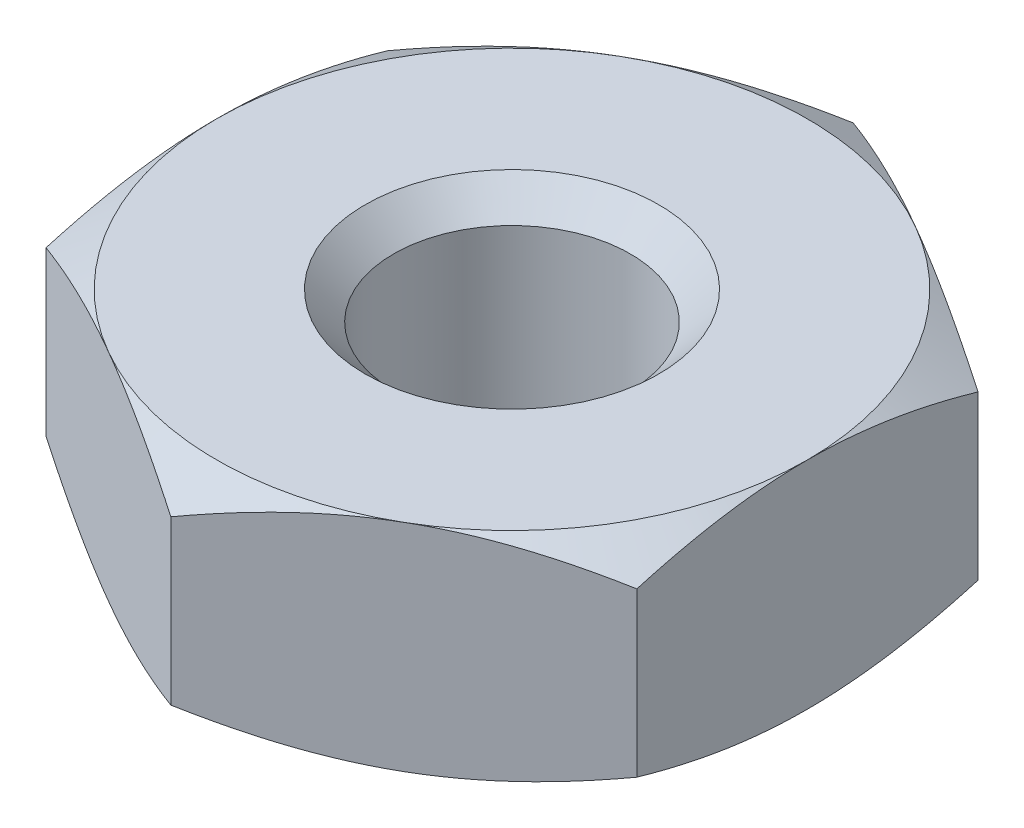
ISO-10303-21;
HEADER;
FILE_DESCRIPTION(('STEP AP214'),'2;1');
FILE_NAME('part.step','',(''),(''),'','','');
FILE_SCHEMA(('AUTOMOTIVE_DESIGN { 1 0 10303 214 1 1 1 1 }'));
ENDSEC;
DATA;
#1=APPLICATION_CONTEXT('core data for automotive mechanical design processes');
#2=APPLICATION_PROTOCOL_DEFINITION('international standard','automotive_design',2000,#1);
#3=PRODUCT_CONTEXT('',#1,'mechanical');
#4=PRODUCT('Part','Part','',(#3));
#5=PRODUCT_RELATED_PRODUCT_CATEGORY('part','',(#4));
#6=PRODUCT_DEFINITION_FORMATION('','',#4);
#7=PRODUCT_DEFINITION_CONTEXT('part definition',#1,'design');
#8=PRODUCT_DEFINITION('design','',#6,#7);
#9=PRODUCT_DEFINITION_SHAPE('','',#8);
#10=(LENGTH_UNIT() NAMED_UNIT(*) SI_UNIT(.MILLI.,.METRE.));
#11=(NAMED_UNIT(*) PLANE_ANGLE_UNIT() SI_UNIT($,.RADIAN.));
#12=(NAMED_UNIT(*) SI_UNIT($,.STERADIAN.) SOLID_ANGLE_UNIT());
#13=UNCERTAINTY_MEASURE_WITH_UNIT(LENGTH_MEASURE(1.E-05),#10,'distance_accuracy_value','');
#14=(GEOMETRIC_REPRESENTATION_CONTEXT(3) GLOBAL_UNCERTAINTY_ASSIGNED_CONTEXT((#13)) GLOBAL_UNIT_ASSIGNED_CONTEXT((#10,
#11,#12)) REPRESENTATION_CONTEXT('',''));
#15=CARTESIAN_POINT('',(0.,0.,0.));
#16=DIRECTION('',(0.,0.,1.));
#17=DIRECTION('',(1.,0.,0.));
#18=AXIS2_PLACEMENT_3D('',#15,#16,#17);
#19=CARTESIAN_POINT('',(0.,1.4478,0.));
#20=DIRECTION('',(0.,1.,0.));
#21=DIRECTION('',(0.,0.,1.));
#22=AXIS2_PLACEMENT_3D('',#19,#20,#21);
#23=PLANE('',#22);
#24=CARTESIAN_POINT('',(0.,1.4478,0.));
#25=DIRECTION('',(0.,1.,0.));
#26=DIRECTION('',(0.,0.,1.));
#27=AXIS2_PLACEMENT_3D('',#24,#25,#26);
#28=CIRCLE('',#27,1.96850000000001);
#29=CARTESIAN_POINT('',(0.,1.4478,1.96850000000001));
#30=VERTEX_POINT('',#29);
#31=EDGE_CURVE('E44',#30,#30,#28,.F.);
#32=ORIENTED_EDGE('',*,*,#31,.T.);
#33=EDGE_LOOP('',(#32));
#34=FACE_BOUND('',#33,.T.);
#35=CARTESIAN_POINT('',(0.,1.4478,0.));
#36=DIRECTION('',(0.,1.,0.));
#37=DIRECTION('',(0.,0.,1.));
#38=AXIS2_PLACEMENT_3D('',#35,#36,#37);
#39=CIRCLE('',#38,3.9624);
#40=CARTESIAN_POINT('',(-1.9812,1.4478,3.43153905995546));
#41=VERTEX_POINT('',#40);
#42=CARTESIAN_POINT('',(-3.9624,1.4478,0.));
#43=VERTEX_POINT('',#42);
#44=EDGE_CURVE('E183',#41,#43,#39,.F.);
#45=ORIENTED_EDGE('',*,*,#44,.F.);
#46=CARTESIAN_POINT('',(1.9812,1.4478,3.43153905995546));
#47=VERTEX_POINT('',#46);
#48=EDGE_CURVE('E132',#47,#41,#39,.F.);
#49=ORIENTED_EDGE('',*,*,#48,.F.);
#50=CARTESIAN_POINT('',(0.,1.4478,0.));
#51=DIRECTION('',(0.,1.,0.));
#52=DIRECTION('',(0.,0.,1.));
#53=AXIS2_PLACEMENT_3D('',#50,#51,#52);
#54=CIRCLE('',#53,3.9624);
#55=CARTESIAN_POINT('',(3.9624,1.4478,0.));
#56=VERTEX_POINT('',#55);
#57=EDGE_CURVE('E329',#47,#56,#54,.T.);
#58=ORIENTED_EDGE('',*,*,#57,.T.);
#59=CARTESIAN_POINT('',(1.9812,1.4478,-3.43153905995546));
#60=VERTEX_POINT('',#59);
#61=EDGE_CURVE('E182',#60,#56,#39,.F.);
#62=ORIENTED_EDGE('',*,*,#61,.F.);
#63=CARTESIAN_POINT('',(-1.9812,1.4478,-3.43153905995546));
#64=VERTEX_POINT('',#63);
#65=EDGE_CURVE('E342',#64,#60,#39,.F.);
#66=ORIENTED_EDGE('',*,*,#65,.F.);
#67=EDGE_CURVE('E343',#43,#64,#39,.F.);
#68=ORIENTED_EDGE('',*,*,#67,.F.);
#69=EDGE_LOOP('',(#45,#49,#58,#62,#66,#68));
#70=FACE_BOUND('',#69,.T.);
#71=ADVANCED_FACE('F35',(#34,#70),#23,.T.);
#72=CARTESIAN_POINT('',(0.,-1.4478,0.));
#73=DIRECTION('',(0.,1.,0.));
#74=DIRECTION('',(0.,0.,1.));
#75=AXIS2_PLACEMENT_3D('',#72,#73,#74);
#76=PLANE('',#75);
#77=CARTESIAN_POINT('',(0.,-1.4478,0.));
#78=DIRECTION('',(0.,1.,0.));
#79=DIRECTION('',(0.,0.,1.));
#80=AXIS2_PLACEMENT_3D('',#77,#78,#79);
#81=CIRCLE('',#80,1.9685);
#82=CARTESIAN_POINT('',(0.,-1.4478,1.9685));
#83=VERTEX_POINT('',#82);
#84=EDGE_CURVE('E11',#83,#83,#81,.T.);
#85=ORIENTED_EDGE('',*,*,#84,.T.);
#86=EDGE_LOOP('',(#85));
#87=FACE_BOUND('',#86,.T.);
#88=CARTESIAN_POINT('',(0.,-1.4478,0.));
#89=DIRECTION('',(0.,1.,0.));
#90=DIRECTION('',(0.,0.,1.));
#91=AXIS2_PLACEMENT_3D('',#88,#89,#90);
#92=CIRCLE('',#91,3.9624);
#93=CARTESIAN_POINT('',(1.9812,-1.4478,3.43153905995546));
#94=VERTEX_POINT('',#93);
#95=CARTESIAN_POINT('',(-1.9812,-1.4478,3.43153905995546));
#96=VERTEX_POINT('',#95);
#97=EDGE_CURVE('E176',#94,#96,#92,.F.);
#98=ORIENTED_EDGE('',*,*,#97,.T.);
#99=CARTESIAN_POINT('',(-3.9624,-1.4478,0.));
#100=VERTEX_POINT('',#99);
#101=EDGE_CURVE('E180',#96,#100,#92,.F.);
#102=ORIENTED_EDGE('',*,*,#101,.T.);
#103=CARTESIAN_POINT('',(-1.9812,-1.4478,-3.43153905995546));
#104=VERTEX_POINT('',#103);
#105=EDGE_CURVE('E510',#100,#104,#92,.F.);
#106=ORIENTED_EDGE('',*,*,#105,.T.);
#107=CARTESIAN_POINT('',(1.9812,-1.4478,-3.43153905995546));
#108=VERTEX_POINT('',#107);
#109=EDGE_CURVE('E517',#104,#108,#92,.F.);
#110=ORIENTED_EDGE('',*,*,#109,.T.);
#111=CARTESIAN_POINT('',(3.9624,-1.4478,0.));
#112=VERTEX_POINT('',#111);
#113=EDGE_CURVE('E179',#108,#112,#92,.F.);
#114=ORIENTED_EDGE('',*,*,#113,.T.);
#115=CARTESIAN_POINT('',(0.,-1.4478,0.));
#116=DIRECTION('',(0.,1.,0.));
#117=DIRECTION('',(0.,0.,1.));
#118=AXIS2_PLACEMENT_3D('',#115,#116,#117);
#119=CIRCLE('',#118,3.9624);
#120=EDGE_CURVE('E222',#94,#112,#119,.T.);
#121=ORIENTED_EDGE('',*,*,#120,.F.);
#122=EDGE_LOOP('',(#98,#102,#106,#110,#114,#121));
#123=FACE_BOUND('',#122,.T.);
#124=ADVANCED_FACE('F211',(#87,#123),#76,.F.);
#125=CARTESIAN_POINT('',(0.,1.4478,4.57538541327395));
#126=DIRECTION('',(-0.5,0.,-0.866025403784439));
#127=DIRECTION('',(-0.866025403784439,0.,0.5));
#128=AXIS2_PLACEMENT_3D('',#125,#126,#127);
#129=PLANE('',#128);
#130=DIRECTION('',(0.,-1.,0.));
#131=VECTOR('',#130,1.);
#132=CARTESIAN_POINT('',(3.9624,1.4478,2.28769270663697));
#133=LINE('',#132,#131);
#134=CARTESIAN_POINT('',(3.9624,1.09389270663698,2.28769270663697));
#135=VERTEX_POINT('',#134);
#136=CARTESIAN_POINT('',(3.9624,-1.09389270663698,2.28769270663697));
#137=VERTEX_POINT('',#136);
#138=EDGE_CURVE('E174',#135,#137,#133,.T.);
#139=ORIENTED_EDGE('',*,*,#138,.F.);
#140=CARTESIAN_POINT('',(3.9626,1.09382603744665,2.28757723658314));
#141=CARTESIAN_POINT('',(3.78847314196163,1.1518894991212,2.38810942494473));
#142=CARTESIAN_POINT('',(3.61284323080695,1.20469601498795,2.48950940142764));
#143=CARTESIAN_POINT('',(3.25854221893717,1.29687012185692,2.69406518600481));
#144=CARTESIAN_POINT('',(3.07986482298996,1.33620510539269,2.79722462865303));
#145=CARTESIAN_POINT('',(2.7247243918441,1.39743546926796,3.00226505217521));
#146=CARTESIAN_POINT('',(2.54831599798983,1.41973837460414,3.10411448585428));
#147=CARTESIAN_POINT('',(2.19466918684792,1.44636294973537,3.30829256746512));
#148=CARTESIAN_POINT('',(2.01743205489282,1.45070666746161,3.41062047330979));
#149=CARTESIAN_POINT('',(1.68625712619974,1.44166818984585,3.6018244075396));
#150=CARTESIAN_POINT('',(1.53226974326828,1.43050524671096,3.69072906452688));
#151=CARTESIAN_POINT('',(1.2252981998238,1.39512590299917,3.86795916776811));
#152=CARTESIAN_POINT('',(1.07231510099383,1.37089741783093,3.95628400105906));
#153=CARTESIAN_POINT('',(0.764710686885742,1.31032832849033,4.13387949234828));
#154=CARTESIAN_POINT('',(0.610128302070048,1.27373098455845,4.22312767383359));
#155=CARTESIAN_POINT('',(0.303269038029469,1.19066950108706,4.40029295253075));
#156=CARTESIAN_POINT('',(0.150988227754979,1.1442248770141,4.48821231933514));
#157=CARTESIAN_POINT('',(-0.000200000000001467,1.09382603744665,4.57550088332778));
#158=B_SPLINE_CURVE_WITH_KNOTS('',3,(#140,#141,#142,#143,#144,#145,#146,#147,#148,#149,#150,
#151,#152,#153,#154,#155,#156,#157),.UNSPECIFIED.,.F.,.F.,(4,2,2,2,2,2,2,2,4),(0.,
0.628087934683976,1.25768556849603,1.87170106915143,2.48496253800264,3.01893254763583,
3.55339728643647,4.09971704494744,4.64496405448818),.UNSPECIFIED.);
#159=EDGE_CURVE('E147',#135,#47,#158,.T.);
#160=ORIENTED_EDGE('',*,*,#159,.T.);
#161=CARTESIAN_POINT('',(0.,1.09389270663698,4.57538541327395));
#162=VERTEX_POINT('',#161);
#163=EDGE_CURVE('E130',#47,#162,#158,.T.);
#164=ORIENTED_EDGE('',*,*,#163,.T.);
#165=DIRECTION('',(0.,-1.,0.));
#166=VECTOR('',#165,1.);
#167=CARTESIAN_POINT('',(0.,1.4478,4.57538541327395));
#168=LINE('',#167,#166);
#169=CARTESIAN_POINT('',(0.,-1.09389270663698,4.57538541327395));
#170=VERTEX_POINT('',#169);
#171=EDGE_CURVE('E145',#162,#170,#168,.T.);
#172=ORIENTED_EDGE('',*,*,#171,.T.);
#173=CARTESIAN_POINT('',(-0.000200000000001955,-1.09382603744665,4.57550088332778));
#174=CARTESIAN_POINT('',(0.173926858038368,-1.1518894991212,4.47496869496619));
#175=CARTESIAN_POINT('',(0.349556769193047,-1.20469601498795,4.37356871848328));
#176=CARTESIAN_POINT('',(0.703857781062827,-1.29687012185692,4.16901293390611));
#177=CARTESIAN_POINT('',(0.882535177010035,-1.33620510539269,4.06585349125789));
#178=CARTESIAN_POINT('',(1.23767560815589,-1.39743546926796,3.86081306773571));
#179=CARTESIAN_POINT('',(1.41408400201016,-1.41973837460414,3.75896363405664));
#180=CARTESIAN_POINT('',(1.76773081315207,-1.44636294973537,3.5547855524458));
#181=CARTESIAN_POINT('',(1.94496794510717,-1.45070666746161,3.45245764660113));
#182=CARTESIAN_POINT('',(2.27614287380026,-1.44166818984585,3.26125371237132));
#183=CARTESIAN_POINT('',(2.43013025673171,-1.43050524671096,3.17234905538404));
#184=CARTESIAN_POINT('',(2.73710180017619,-1.39512590299917,2.99511895214281));
#185=CARTESIAN_POINT('',(2.89008489900617,-1.37089741783093,2.90679411885186));
#186=CARTESIAN_POINT('',(3.19768931311425,-1.31032832849033,2.72919862756264));
#187=CARTESIAN_POINT('',(3.35227169792995,-1.27373098455845,2.63995044607733));
#188=CARTESIAN_POINT('',(3.65913096197053,-1.19066950108706,2.46278516738017));
#189=CARTESIAN_POINT('',(3.81141177224502,-1.1442248770141,2.37486580057578));
#190=CARTESIAN_POINT('',(3.9626,-1.09382603744665,2.28757723658314));
#191=B_SPLINE_CURVE_WITH_KNOTS('',3,(#173,#174,#175,#176,#177,#178,#179,#180,#181,#182,#183,
#184,#185,#186,#187,#188,#189,#190),.UNSPECIFIED.,.F.,.F.,(4,2,2,2,2,2,2,2,4),(0.,
0.628087934683977,1.25768556849603,1.87170106915143,2.48496253800264,3.01893254763583,
3.55339728643647,4.09971704494744,4.64496405448818),.UNSPECIFIED.);
#192=EDGE_CURVE('E155',#170,#94,#191,.T.);
#193=ORIENTED_EDGE('',*,*,#192,.T.);
#194=EDGE_CURVE('E159',#94,#137,#191,.T.);
#195=ORIENTED_EDGE('',*,*,#194,.T.);
#196=EDGE_LOOP('',(#139,#160,#164,#172,#193,#195));
#197=FACE_BOUND('',#196,.T.);
#198=ADVANCED_FACE('F143',(#197),#129,.F.);
#199=CARTESIAN_POINT('',(3.9624,1.4478,2.28769270663697));
#200=DIRECTION('',(-1.,0.,0.));
#201=DIRECTION('',(0.,0.,1.));
#202=AXIS2_PLACEMENT_3D('',#199,#200,#201);
#203=PLANE('',#202);
#204=DIRECTION('',(0.,-1.,0.));
#205=VECTOR('',#204,1.);
#206=CARTESIAN_POINT('',(3.9624,1.4478,-2.28769270663697));
#207=LINE('',#206,#205);
#208=CARTESIAN_POINT('',(3.9624,1.09389270663698,-2.28769270663697));
#209=VERTEX_POINT('',#208);
#210=CARTESIAN_POINT('',(3.9624,-1.09389270663698,-2.28769270663697));
#211=VERTEX_POINT('',#210);
#212=EDGE_CURVE('E172',#209,#211,#207,.T.);
#213=ORIENTED_EDGE('',*,*,#212,.F.);
#214=CARTESIAN_POINT('',(3.9624,-0.846827955176388,-6.87694511996759));
#215=CARTESIAN_POINT('',(3.9624,-0.764498186575615,-6.7123428075543));
#216=CARTESIAN_POINT('',(3.9624,-0.682736776901853,-6.54745319961846));
#217=CARTESIAN_POINT('',(3.9624,-0.520625337655295,-6.21696845103487));
#218=CARTESIAN_POINT('',(3.9624,-0.440275402756545,-6.05137326397937));
#219=CARTESIAN_POINT('',(3.9624,-0.281112361448725,-5.7190336854968));
#220=CARTESIAN_POINT('',(3.9624,-0.202302680236489,-5.55228765019459));
#221=CARTESIAN_POINT('',(3.9624,-0.0467689561747381,-5.21782783253457));
#222=CARTESIAN_POINT('',(3.9624,0.0299551275225364,-5.05011406920843));
#223=CARTESIAN_POINT('',(3.9624,0.184230945588609,-4.70595985799169));
#224=CARTESIAN_POINT('',(3.9624,0.261664588531371,-4.52946629764683));
#225=CARTESIAN_POINT('',(3.9624,0.413004481416677,-4.17497466521404));
#226=CARTESIAN_POINT('',(3.9624,0.486910854345802,-3.99697664583772));
#227=CARTESIAN_POINT('',(3.9624,0.630207267728787,-3.63928118207367));
#228=CARTESIAN_POINT('',(3.9624,0.699599911918298,-3.45958478715711));
#229=CARTESIAN_POINT('',(3.9624,0.832654360967113,-3.09809221292883));
#230=CARTESIAN_POINT('',(3.9624,0.896316793732896,-2.91629626615157));
#231=CARTESIAN_POINT('',(3.9624,1.03038741805603,-2.50735389421121));
#232=CARTESIAN_POINT('',(3.9624,1.0988772262701,-2.27956883786375));
#233=CARTESIAN_POINT('',(3.9624,1.22079661971305,-1.81989180667724));
#234=CARTESIAN_POINT('',(3.9624,1.27422755821815,-1.58800020286789));
#235=CARTESIAN_POINT('',(3.9624,1.33932352898976,-1.23939483965845));
#236=CARTESIAN_POINT('',(3.9624,1.35841275888706,-1.1240547546709));
#237=CARTESIAN_POINT('',(3.9624,1.3913617031769,-0.89263647119892));
#238=CARTESIAN_POINT('',(3.9624,1.40522217228751,-0.77655838169925));
#239=CARTESIAN_POINT('',(3.9624,1.42729886995324,-0.543896135981941));
#240=CARTESIAN_POINT('',(3.9624,1.43551672447737,-0.427312135299846));
#241=CARTESIAN_POINT('',(3.9624,1.44604863251693,-0.193875693749986));
#242=CARTESIAN_POINT('',(3.9624,1.44836271085358,-0.0770232540128857));
#243=CARTESIAN_POINT('',(3.9624,1.44700228200561,0.157348029925358));
#244=CARTESIAN_POINT('',(3.9624,1.44329182782577,0.274866674145883));
#245=CARTESIAN_POINT('',(3.9624,1.42994860440544,0.509557759656442));
#246=CARTESIAN_POINT('',(3.9624,1.42031580885376,0.626730199406068));
#247=CARTESIAN_POINT('',(3.9624,1.38295531470112,0.977410309509105));
#248=CARTESIAN_POINT('',(3.9624,1.3467658598802,1.21004543714717));
#249=CARTESIAN_POINT('',(3.9624,1.25498527482723,1.67541715445484));
#250=CARTESIAN_POINT('',(3.9624,1.19907377102914,1.90808780532356));
#251=CARTESIAN_POINT('',(3.9624,1.07255670895525,2.36946057952585));
#252=CARTESIAN_POINT('',(3.9624,1.00194288838555,2.59816039272877));
#253=CARTESIAN_POINT('',(3.9624,0.866020327811573,3.00368556929757));
#254=CARTESIAN_POINT('',(3.9624,0.802769204408394,3.18121382947534));
#255=CARTESIAN_POINT('',(3.9624,0.671000342458403,3.53424143457496));
#256=CARTESIAN_POINT('',(3.9624,0.602484053417731,3.70974132271269));
#257=CARTESIAN_POINT('',(3.9624,0.461253205392453,4.05917312481852));
#258=CARTESIAN_POINT('',(3.9624,0.388535803591991,4.23310388274967));
#259=CARTESIAN_POINT('',(3.9624,0.239805004282646,4.57955182070199));
#260=CARTESIAN_POINT('',(3.9624,0.163791505153723,4.75206895694539));
#261=CARTESIAN_POINT('',(3.9624,0.0123957578320725,5.08865289065001));
#262=CARTESIAN_POINT('',(3.9624,-0.0628775500154029,5.25276884371343));
#263=CARTESIAN_POINT('',(3.9624,-0.215395379140379,5.58007748279647));
#264=CARTESIAN_POINT('',(3.9624,-0.292639869827929,5.7432701830957));
#265=CARTESIAN_POINT('',(3.9624,-0.448610872481416,6.06858881324152));
#266=CARTESIAN_POINT('',(3.9624,-0.52733451703435,6.23071612062808));
#267=CARTESIAN_POINT('',(3.9624,-0.686132811219577,6.55430258198902));
#268=CARTESIAN_POINT('',(3.9624,-0.766207423134149,6.71576175446089));
#269=CARTESIAN_POINT('',(3.9624,-0.846827955176393,6.87694511996759));
#270=B_SPLINE_CURVE_WITH_KNOTS('',3,(#214,#215,#216,#217,#218,#219,#220,#221,#222,#223,#224,
#225,#226,#227,#228,#229,#230,#231,#232,#233,#234,#235,#236,#237,#238,#239,#240,#241,#242,#243,
#244,#245,#246,#247,#248,#249,#250,#251,#252,#253,#254,#255,#256,#257,#258,#259,#260,#261,#262,
#263,#264,#265,#266,#267,#268,#269),.UNSPECIFIED.,.F.,.F.,(4,2,2,2,2,2,2,2,2,2,2,2,2,2,2,2,2,2,
2,2,2,2,2,2,2,2,2,4),(0.,0.55213425333843,1.10430540050877,1.6575898398137,2.21086343487001,
2.78903155916892,3.36717950952376,3.94499094331812,4.52273898427512,5.2359552082885,
5.9491073181582,6.29973465806838,6.65031136913128,7.00078701598875,7.35126118933977,
7.70383425668021,8.0564088904094,8.76166369177209,9.47894678955384,10.1966340738072,
10.7619206037852,11.3270520634525,11.8925705212031,12.4581064265345,12.9997560719459,
13.5413973168318,14.082079166822,14.6227459463884),.UNSPECIFIED.);
#271=EDGE_CURVE('E298',#209,#56,#270,.T.);
#272=ORIENTED_EDGE('',*,*,#271,.T.);
#273=EDGE_CURVE('E291',#56,#135,#270,.T.);
#274=ORIENTED_EDGE('',*,*,#273,.T.);
#275=ORIENTED_EDGE('',*,*,#138,.T.);
#276=CARTESIAN_POINT('',(3.9624,0.846827955176392,6.87694511996759));
#277=CARTESIAN_POINT('',(3.9624,0.764498186575619,6.7123428075543));
#278=CARTESIAN_POINT('',(3.9624,0.682736776901857,6.54745319961846));
#279=CARTESIAN_POINT('',(3.9624,0.520625337655299,6.21696845103487));
#280=CARTESIAN_POINT('',(3.9624,0.44027540275655,6.05137326397937));
#281=CARTESIAN_POINT('',(3.9624,0.28111236144873,5.7190336854968));
#282=CARTESIAN_POINT('',(3.9624,0.202302680236493,5.55228765019459));
#283=CARTESIAN_POINT('',(3.9624,0.0467689561747428,5.21782783253457));
#284=CARTESIAN_POINT('',(3.9624,-0.0299551275225319,5.05011406920843));
#285=CARTESIAN_POINT('',(3.9624,-0.184230945588605,4.7059598579917));
#286=CARTESIAN_POINT('',(3.9624,-0.261664588531367,4.52946629764684));
#287=CARTESIAN_POINT('',(3.9624,-0.413004481416672,4.17497466521405));
#288=CARTESIAN_POINT('',(3.9624,-0.486910854345797,3.99697664583773));
#289=CARTESIAN_POINT('',(3.9624,-0.630207267728783,3.63928118207367));
#290=CARTESIAN_POINT('',(3.9624,-0.699599911918295,3.45958478715712));
#291=CARTESIAN_POINT('',(3.9624,-0.83265436096711,3.09809221292883));
#292=CARTESIAN_POINT('',(3.9624,-0.896316793732893,2.91629626615157));
#293=CARTESIAN_POINT('',(3.9624,-1.03038741805602,2.50735389421121));
#294=CARTESIAN_POINT('',(3.9624,-1.0988772262701,2.27956883786376));
#295=CARTESIAN_POINT('',(3.9624,-1.22079661971305,1.81989180667724));
#296=CARTESIAN_POINT('',(3.9624,-1.27422755821815,1.58800020286789));
#297=CARTESIAN_POINT('',(3.9624,-1.33932352898976,1.23939483965845));
#298=CARTESIAN_POINT('',(3.9624,-1.35841275888706,1.1240547546709));
#299=CARTESIAN_POINT('',(3.9624,-1.3913617031769,0.892636471198924));
#300=CARTESIAN_POINT('',(3.9624,-1.40522217228751,0.776558381699254));
#301=CARTESIAN_POINT('',(3.9624,-1.42729886995324,0.543896135981944));
#302=CARTESIAN_POINT('',(3.9624,-1.43551672447737,0.427312135299849));
#303=CARTESIAN_POINT('',(3.9624,-1.44604863251693,0.19387569374999));
#304=CARTESIAN_POINT('',(3.9624,-1.44836271085358,0.0770232540128899));
#305=CARTESIAN_POINT('',(3.9624,-1.44700228200561,-0.157348029925353));
#306=CARTESIAN_POINT('',(3.9624,-1.44329182782577,-0.274866674145878));
#307=CARTESIAN_POINT('',(3.9624,-1.42994860440544,-0.509557759656438));
#308=CARTESIAN_POINT('',(3.9624,-1.42031580885376,-0.626730199406064));
#309=CARTESIAN_POINT('',(3.9624,-1.38295531470112,-0.977410309509102));
#310=CARTESIAN_POINT('',(3.9624,-1.3467658598802,-1.21004543714716));
#311=CARTESIAN_POINT('',(3.9624,-1.25498527482723,-1.67541715445483));
#312=CARTESIAN_POINT('',(3.9624,-1.19907377102915,-1.90808780532356));
#313=CARTESIAN_POINT('',(3.9624,-1.07255670895526,-2.36946057952584));
#314=CARTESIAN_POINT('',(3.9624,-1.00194288838556,-2.59816039272877));
#315=CARTESIAN_POINT('',(3.9624,-0.866020327811575,-3.00368556929757));
#316=CARTESIAN_POINT('',(3.9624,-0.802769204408396,-3.18121382947534));
#317=CARTESIAN_POINT('',(3.9624,-0.671000342458407,-3.53424143457495));
#318=CARTESIAN_POINT('',(3.9624,-0.602484053417734,-3.70974132271268));
#319=CARTESIAN_POINT('',(3.9624,-0.461253205392456,-4.05917312481852));
#320=CARTESIAN_POINT('',(3.9624,-0.388535803591994,-4.23310388274966));
#321=CARTESIAN_POINT('',(3.9624,-0.239805004282649,-4.57955182070199));
#322=CARTESIAN_POINT('',(3.9624,-0.163791505153726,-4.75206895694539));
#323=CARTESIAN_POINT('',(3.9624,-0.0123957578320757,-5.08865289065001));
#324=CARTESIAN_POINT('',(3.9624,0.0628775500153997,-5.25276884371343));
#325=CARTESIAN_POINT('',(3.9624,0.215395379140375,-5.58007748279646));
#326=CARTESIAN_POINT('',(3.9624,0.292639869827925,-5.7432701830957));
#327=CARTESIAN_POINT('',(3.9624,0.448610872481412,-6.06858881324152));
#328=CARTESIAN_POINT('',(3.9624,0.527334517034345,-6.23071612062808));
#329=CARTESIAN_POINT('',(3.9624,0.686132811219573,-6.55430258198902));
#330=CARTESIAN_POINT('',(3.9624,0.766207423134145,-6.71576175446088));
#331=CARTESIAN_POINT('',(3.9624,0.846827955176387,-6.87694511996759));
#332=B_SPLINE_CURVE_WITH_KNOTS('',3,(#276,#277,#278,#279,#280,#281,#282,#283,#284,#285,#286,
#287,#288,#289,#290,#291,#292,#293,#294,#295,#296,#297,#298,#299,#300,#301,#302,#303,#304,#305,
#306,#307,#308,#309,#310,#311,#312,#313,#314,#315,#316,#317,#318,#319,#320,#321,#322,#323,#324,
#325,#326,#327,#328,#329,#330,#331),.UNSPECIFIED.,.F.,.F.,(4,2,2,2,2,2,2,2,2,2,2,2,2,2,2,2,2,2,
2,2,2,2,2,2,2,2,2,4),(0.,0.552134253338431,1.10430540050877,1.6575898398137,2.21086343487001,
2.78903155916891,3.36717950952375,3.94499094331812,4.52273898427512,5.23595520828849,
5.9491073181582,6.29973465806838,6.65031136913128,7.00078701598875,7.35126118933976,
7.7038342566802,8.0564088904094,8.76166369177209,9.47894678955383,10.1966340738072,
10.7619206037852,11.3270520634525,11.8925705212031,12.4581064265345,12.9997560719459,
13.5413973168318,14.082079166822,14.6227459463884),.UNSPECIFIED.);
#333=EDGE_CURVE('E280',#137,#112,#332,.T.);
#334=ORIENTED_EDGE('',*,*,#333,.T.);
#335=EDGE_CURVE('E273',#112,#211,#332,.T.);
#336=ORIENTED_EDGE('',*,*,#335,.T.);
#337=EDGE_LOOP('',(#213,#272,#274,#275,#334,#336));
#338=FACE_BOUND('',#337,.T.);
#339=ADVANCED_FACE('F282',(#338),#203,.F.);
#340=CARTESIAN_POINT('',(3.9624,1.4478,-2.28769270663697));
#341=DIRECTION('',(-0.5,0.,0.866025403784439));
#342=DIRECTION('',(0.866025403784439,0.,0.5));
#343=AXIS2_PLACEMENT_3D('',#340,#341,#342);
#344=PLANE('',#343);
#345=DIRECTION('',(0.,-1.,0.));
#346=VECTOR('',#345,1.);
#347=CARTESIAN_POINT('',(0.,1.4478,-4.57538541327395));
#348=LINE('',#347,#346);
#349=CARTESIAN_POINT('',(0.,1.09389270663698,-4.57538541327395));
#350=VERTEX_POINT('',#349);
#351=CARTESIAN_POINT('',(0.,-1.09389270663698,-4.57538541327395));
#352=VERTEX_POINT('',#351);
#353=EDGE_CURVE('E170',#350,#352,#348,.T.);
#354=ORIENTED_EDGE('',*,*,#353,.F.);
#355=CARTESIAN_POINT('',(-0.000199999999998077,1.09382603744665,-4.57550088332778));
#356=CARTESIAN_POINT('',(0.173926858038372,1.1518894991212,-4.47496869496619));
#357=CARTESIAN_POINT('',(0.349556769193051,1.20469601498795,-4.37356871848328));
#358=CARTESIAN_POINT('',(0.703857781062831,1.29687012185692,-4.16901293390611));
#359=CARTESIAN_POINT('',(0.88253517701004,1.33620510539269,-4.06585349125789));
#360=CARTESIAN_POINT('',(1.2376756081559,1.39743546926796,-3.8608130677357));
#361=CARTESIAN_POINT('',(1.41408400201017,1.41973837460415,-3.75896363405663));
#362=CARTESIAN_POINT('',(1.76773081315208,1.44636294973538,-3.5547855524458));
#363=CARTESIAN_POINT('',(1.94496794510718,1.45070666746162,-3.45245764660112));
#364=CARTESIAN_POINT('',(2.27614287380026,1.44166818984585,-3.26125371237132));
#365=CARTESIAN_POINT('',(2.43013025673172,1.43050524671096,-3.17234905538404));
#366=CARTESIAN_POINT('',(2.7371018001762,1.39512590299917,-2.99511895214281));
#367=CARTESIAN_POINT('',(2.89008489900617,1.37089741783093,-2.90679411885186));
#368=CARTESIAN_POINT('',(3.19768931311426,1.31032832849033,-2.72919862756264));
#369=CARTESIAN_POINT('',(3.35227169792995,1.27373098455845,-2.63995044607732));
#370=CARTESIAN_POINT('',(3.65913096197053,1.19066950108706,-2.46278516738017));
#371=CARTESIAN_POINT('',(3.81141177224502,1.1442248770141,-2.37486580057578));
#372=CARTESIAN_POINT('',(3.9626,1.09382603744665,-2.28757723658314));
#373=B_SPLINE_CURVE_WITH_KNOTS('',3,(#355,#356,#357,#358,#359,#360,#361,#362,#363,#364,#365,
#366,#367,#368,#369,#370,#371,#372),.UNSPECIFIED.,.F.,.F.,(4,2,2,2,2,2,2,2,4),(0.,
0.628087934683977,1.25768556849603,1.87170106915143,2.48496253800265,3.01893254763583,
3.55339728643647,4.09971704494744,4.64496405448818),.UNSPECIFIED.);
#374=EDGE_CURVE('E310',#350,#60,#373,.T.);
#375=ORIENTED_EDGE('',*,*,#374,.T.);
#376=EDGE_CURVE('E304',#60,#209,#373,.T.);
#377=ORIENTED_EDGE('',*,*,#376,.T.);
#378=ORIENTED_EDGE('',*,*,#212,.T.);
#379=CARTESIAN_POINT('',(3.9626,-1.09382603744665,-2.28757723658314));
#380=CARTESIAN_POINT('',(3.78847314196163,-1.1518894991212,-2.38810942494473));
#381=CARTESIAN_POINT('',(3.61284323080695,-1.20469601498795,-2.48950940142764));
#382=CARTESIAN_POINT('',(3.25854221893717,-1.29687012185692,-2.69406518600481));
#383=CARTESIAN_POINT('',(3.07986482298996,-1.33620510539269,-2.79722462865303));
#384=CARTESIAN_POINT('',(2.7247243918441,-1.39743546926796,-3.00226505217521));
#385=CARTESIAN_POINT('',(2.54831599798984,-1.41973837460415,-3.10411448585428));
#386=CARTESIAN_POINT('',(2.19466918684793,-1.44636294973538,-3.30829256746512));
#387=CARTESIAN_POINT('',(2.01743205489283,-1.45070666746161,-3.41062047330979));
#388=CARTESIAN_POINT('',(1.68625712619974,-1.44166818984585,-3.6018244075396));
#389=CARTESIAN_POINT('',(1.53226974326829,-1.43050524671096,-3.69072906452688));
#390=CARTESIAN_POINT('',(1.22529819982381,-1.39512590299917,-3.86795916776811));
#391=CARTESIAN_POINT('',(1.07231510099383,-1.37089741783093,-3.95628400105906));
#392=CARTESIAN_POINT('',(0.764710686885745,-1.31032832849033,-4.13387949234828));
#393=CARTESIAN_POINT('',(0.610128302070051,-1.27373098455845,-4.22312767383359));
#394=CARTESIAN_POINT('',(0.303269038029472,-1.19066950108706,-4.40029295253075));
#395=CARTESIAN_POINT('',(0.150988227754982,-1.1442248770141,-4.48821231933514));
#396=CARTESIAN_POINT('',(-0.000199999999998303,-1.09382603744665,-4.57550088332778));
#397=B_SPLINE_CURVE_WITH_KNOTS('',3,(#379,#380,#381,#382,#383,#384,#385,#386,#387,#388,#389,
#390,#391,#392,#393,#394,#395,#396),.UNSPECIFIED.,.F.,.F.,(4,2,2,2,2,2,2,2,4),(0.,
0.628087934683977,1.25768556849603,1.87170106915143,2.48496253800264,3.01893254763583,
3.55339728643647,4.09971704494744,4.64496405448818),.UNSPECIFIED.);
#398=EDGE_CURVE('E281',#211,#108,#397,.T.);
#399=ORIENTED_EDGE('',*,*,#398,.T.);
#400=EDGE_CURVE('E267',#108,#352,#397,.T.);
#401=ORIENTED_EDGE('',*,*,#400,.T.);
#402=EDGE_LOOP('',(#354,#375,#377,#378,#399,#401));
#403=FACE_BOUND('',#402,.T.);
#404=ADVANCED_FACE('F285',(#403),#344,.F.);
#405=CARTESIAN_POINT('',(0.,1.4478,-4.57538541327395));
#406=DIRECTION('',(0.5,0.,0.866025403784439));
#407=DIRECTION('',(0.866025403784439,0.,-0.5));
#408=AXIS2_PLACEMENT_3D('',#405,#406,#407);
#409=PLANE('',#408);
#410=DIRECTION('',(0.,-1.,0.));
#411=VECTOR('',#410,1.);
#412=CARTESIAN_POINT('',(-3.9624,1.4478,-2.28769270663697));
#413=LINE('',#412,#411);
#414=CARTESIAN_POINT('',(-3.9624,1.09389270663698,-2.28769270663697));
#415=VERTEX_POINT('',#414);
#416=CARTESIAN_POINT('',(-3.9624,-1.09389270663698,-2.28769270663697));
#417=VERTEX_POINT('',#416);
#418=EDGE_CURVE('E157',#415,#417,#413,.T.);
#419=ORIENTED_EDGE('',*,*,#418,.F.);
#420=CARTESIAN_POINT('',(-3.9626,1.09382603744665,-2.28757723658314));
#421=CARTESIAN_POINT('',(-3.78847314196163,1.1518894991212,-2.38810942494473));
#422=CARTESIAN_POINT('',(-3.61284323080695,1.20469601498795,-2.48950940142764));
#423=CARTESIAN_POINT('',(-3.25854221893717,1.29687012185692,-2.69406518600481));
#424=CARTESIAN_POINT('',(-3.07986482298996,1.33620510539269,-2.79722462865303));
#425=CARTESIAN_POINT('',(-2.7247243918441,1.39743546926796,-3.00226505217521));
#426=CARTESIAN_POINT('',(-2.54831599798983,1.41973837460415,-3.10411448585428));
#427=CARTESIAN_POINT('',(-2.19466918684792,1.44636294973538,-3.30829256746512));
#428=CARTESIAN_POINT('',(-2.01743205489282,1.45070666746162,-3.41062047330979));
#429=CARTESIAN_POINT('',(-1.68625712619974,1.44166818984585,-3.6018244075396));
#430=CARTESIAN_POINT('',(-1.53226974326828,1.43050524671096,-3.69072906452688));
#431=CARTESIAN_POINT('',(-1.2252981998238,1.39512590299917,-3.86795916776811));
#432=CARTESIAN_POINT('',(-1.07231510099383,1.37089741783093,-3.95628400105906));
#433=CARTESIAN_POINT('',(-0.764710686885742,1.31032832849033,-4.13387949234828));
#434=CARTESIAN_POINT('',(-0.610128302070048,1.27373098455845,-4.22312767383359));
#435=CARTESIAN_POINT('',(-0.303269038029469,1.19066950108706,-4.40029295253075));
#436=CARTESIAN_POINT('',(-0.150988227754978,1.1442248770141,-4.48821231933514));
#437=CARTESIAN_POINT('',(0.000200000000002299,1.09382603744665,-4.57550088332778));
#438=B_SPLINE_CURVE_WITH_KNOTS('',3,(#420,#421,#422,#423,#424,#425,#426,#427,#428,#429,#430,
#431,#432,#433,#434,#435,#436,#437),.UNSPECIFIED.,.F.,.F.,(4,2,2,2,2,2,2,2,4),(0.,
0.628087934683976,1.25768556849603,1.87170106915143,2.48496253800264,3.01893254763583,
3.55339728643647,4.09971704494744,4.64496405448818),.UNSPECIFIED.);
#439=EDGE_CURVE('E299',#415,#64,#438,.T.);
#440=ORIENTED_EDGE('',*,*,#439,.T.);
#441=EDGE_CURVE('E59',#64,#350,#438,.T.);
#442=ORIENTED_EDGE('',*,*,#441,.T.);
#443=ORIENTED_EDGE('',*,*,#353,.T.);
#444=CARTESIAN_POINT('',(0.000200000000001947,-1.09382603744665,-4.57550088332778));
#445=CARTESIAN_POINT('',(-0.173926858038368,-1.1518894991212,-4.47496869496619));
#446=CARTESIAN_POINT('',(-0.349556769193047,-1.20469601498795,-4.37356871848328));
#447=CARTESIAN_POINT('',(-0.703857781062828,-1.29687012185692,-4.16901293390611));
#448=CARTESIAN_POINT('',(-0.882535177010036,-1.33620510539269,-4.06585349125789));
#449=CARTESIAN_POINT('',(-1.2376756081559,-1.39743546926796,-3.86081306773571));
#450=CARTESIAN_POINT('',(-1.41408400201016,-1.41973837460415,-3.75896363405664));
#451=CARTESIAN_POINT('',(-1.76773081315207,-1.44636294973538,-3.5547855524458));
#452=CARTESIAN_POINT('',(-1.94496794510717,-1.45070666746162,-3.45245764660113));
#453=CARTESIAN_POINT('',(-2.27614287380026,-1.44166818984585,-3.26125371237132));
#454=CARTESIAN_POINT('',(-2.43013025673171,-1.43050524671096,-3.17234905538404));
#455=CARTESIAN_POINT('',(-2.73710180017619,-1.39512590299917,-2.99511895214281));
#456=CARTESIAN_POINT('',(-2.89008489900617,-1.37089741783093,-2.90679411885186));
#457=CARTESIAN_POINT('',(-3.19768931311425,-1.31032832849033,-2.72919862756264));
#458=CARTESIAN_POINT('',(-3.35227169792995,-1.27373098455845,-2.63995044607733));
#459=CARTESIAN_POINT('',(-3.65913096197053,-1.19066950108706,-2.46278516738017));
#460=CARTESIAN_POINT('',(-3.81141177224502,-1.1442248770141,-2.37486580057578));
#461=CARTESIAN_POINT('',(-3.9626,-1.09382603744665,-2.28757723658314));
#462=B_SPLINE_CURVE_WITH_KNOTS('',3,(#444,#445,#446,#447,#448,#449,#450,#451,#452,#453,#454,
#455,#456,#457,#458,#459,#460,#461),.UNSPECIFIED.,.F.,.F.,(4,2,2,2,2,2,2,2,4),(0.,
0.628087934683977,1.25768556849603,1.87170106915143,2.48496253800264,3.01893254763583,
3.55339728643647,4.09971704494744,4.64496405448818),.UNSPECIFIED.);
#463=EDGE_CURVE('E524',#352,#104,#462,.T.);
#464=ORIENTED_EDGE('',*,*,#463,.T.);
#465=EDGE_CURVE('E260',#104,#417,#462,.T.);
#466=ORIENTED_EDGE('',*,*,#465,.T.);
#467=EDGE_LOOP('',(#419,#440,#442,#443,#464,#466));
#468=FACE_BOUND('',#467,.T.);
#469=ADVANCED_FACE('F378',(#468),#409,.F.);
#470=CARTESIAN_POINT('',(-3.9624,1.4478,-2.28769270663697));
#471=DIRECTION('',(1.,0.,0.));
#472=DIRECTION('',(0.,0.,-1.));
#473=AXIS2_PLACEMENT_3D('',#470,#471,#472);
#474=PLANE('',#473);
#475=DIRECTION('',(0.,-1.,0.));
#476=VECTOR('',#475,1.);
#477=CARTESIAN_POINT('',(-3.9624,1.4478,2.28769270663697));
#478=LINE('',#477,#476);
#479=CARTESIAN_POINT('',(-3.9624,1.09389270663698,2.28769270663697));
#480=VERTEX_POINT('',#479);
#481=CARTESIAN_POINT('',(-3.9624,-1.09389270663698,2.28769270663697));
#482=VERTEX_POINT('',#481);
#483=EDGE_CURVE('E154',#480,#482,#478,.T.);
#484=ORIENTED_EDGE('',*,*,#483,.F.);
#485=CARTESIAN_POINT('',(-3.9624,-0.846827955176392,6.87694511996759));
#486=CARTESIAN_POINT('',(-3.9624,-0.764498186575617,6.7123428075543));
#487=CARTESIAN_POINT('',(-3.9624,-0.682736776901855,6.54745319961846));
#488=CARTESIAN_POINT('',(-3.9624,-0.520625337655298,6.21696845103487));
#489=CARTESIAN_POINT('',(-3.9624,-0.440275402756549,6.05137326397936));
#490=CARTESIAN_POINT('',(-3.9624,-0.281112361448729,5.7190336854968));
#491=CARTESIAN_POINT('',(-3.9624,-0.202302680236492,5.55228765019459));
#492=CARTESIAN_POINT('',(-3.9624,-0.0467689561747419,5.21782783253457));
#493=CARTESIAN_POINT('',(-3.9624,0.0299551275225325,5.05011406920843));
#494=CARTESIAN_POINT('',(-3.9624,0.184230945588605,4.70595985799169));
#495=CARTESIAN_POINT('',(-3.9624,0.261664588531368,4.52946629764683));
#496=CARTESIAN_POINT('',(-3.9624,0.413004481416673,4.17497466521405));
#497=CARTESIAN_POINT('',(-3.9624,0.486910854345798,3.99697664583773));
#498=CARTESIAN_POINT('',(-3.9624,0.630207267728783,3.63928118207367));
#499=CARTESIAN_POINT('',(-3.9624,0.699599911918295,3.45958478715711));
#500=CARTESIAN_POINT('',(-3.9624,0.832654360967111,3.09809221292883));
#501=CARTESIAN_POINT('',(-3.9624,0.896316793732894,2.91629626615157));
#502=CARTESIAN_POINT('',(-3.9624,1.03038741805602,2.50735389421121));
#503=CARTESIAN_POINT('',(-3.9624,1.0988772262701,2.27956883786376));
#504=CARTESIAN_POINT('',(-3.9624,1.22079661971305,1.81989180667724));
#505=CARTESIAN_POINT('',(-3.9624,1.27422755821815,1.58800020286789));
#506=CARTESIAN_POINT('',(-3.9624,1.33932352898976,1.23939483965845));
#507=CARTESIAN_POINT('',(-3.9624,1.35841275888706,1.1240547546709));
#508=CARTESIAN_POINT('',(-3.9624,1.3913617031769,0.892636471198923));
#509=CARTESIAN_POINT('',(-3.9624,1.40522217228751,0.776558381699254));
#510=CARTESIAN_POINT('',(-3.9624,1.42729886995324,0.543896135981944));
#511=CARTESIAN_POINT('',(-3.9624,1.43551672447737,0.427312135299849));
#512=CARTESIAN_POINT('',(-3.9624,1.44604863251693,0.193875693749989));
#513=CARTESIAN_POINT('',(-3.9624,1.44836271085358,0.0770232540128889));
#514=CARTESIAN_POINT('',(-3.9624,1.44700228200561,-0.157348029925355));
#515=CARTESIAN_POINT('',(-3.9624,1.44329182782577,-0.27486667414588));
#516=CARTESIAN_POINT('',(-3.9624,1.42994860440544,-0.50955775965644));
#517=CARTESIAN_POINT('',(-3.9624,1.42031580885376,-0.626730199406066));
#518=CARTESIAN_POINT('',(-3.9624,1.38295531470112,-0.977410309509103));
#519=CARTESIAN_POINT('',(-3.9624,1.3467658598802,-1.21004543714716));
#520=CARTESIAN_POINT('',(-3.9624,1.25498527482723,-1.67541715445484));
#521=CARTESIAN_POINT('',(-3.9624,1.19907377102915,-1.90808780532356));
#522=CARTESIAN_POINT('',(-3.9624,1.07255670895525,-2.36946057952584));
#523=CARTESIAN_POINT('',(-3.9624,1.00194288838556,-2.59816039272877));
#524=CARTESIAN_POINT('',(-3.9624,0.866020327811575,-3.00368556929757));
#525=CARTESIAN_POINT('',(-3.9624,0.802769204408396,-3.18121382947534));
#526=CARTESIAN_POINT('',(-3.9624,0.671000342458406,-3.53424143457496));
#527=CARTESIAN_POINT('',(-3.9624,0.602484053417734,-3.70974132271268));
#528=CARTESIAN_POINT('',(-3.9624,0.461253205392455,-4.05917312481852));
#529=CARTESIAN_POINT('',(-3.9624,0.388535803591993,-4.23310388274966));
#530=CARTESIAN_POINT('',(-3.9624,0.239805004282648,-4.57955182070199));
#531=CARTESIAN_POINT('',(-3.9624,0.163791505153726,-4.75206895694539));
#532=CARTESIAN_POINT('',(-3.9624,0.0123957578320752,-5.08865289065001));
#533=CARTESIAN_POINT('',(-3.9624,-0.0628775500154003,-5.25276884371343));
#534=CARTESIAN_POINT('',(-3.9624,-0.215395379140376,-5.58007748279647));
#535=CARTESIAN_POINT('',(-3.9624,-0.292639869827926,-5.7432701830957));
#536=CARTESIAN_POINT('',(-3.9624,-0.448610872481412,-6.06858881324152));
#537=CARTESIAN_POINT('',(-3.9624,-0.527334517034346,-6.23071612062807));
#538=CARTESIAN_POINT('',(-3.9624,-0.686132811219573,-6.55430258198902));
#539=CARTESIAN_POINT('',(-3.9624,-0.766207423134146,-6.71576175446088));
#540=CARTESIAN_POINT('',(-3.9624,-0.846827955176388,-6.87694511996759));
#541=B_SPLINE_CURVE_WITH_KNOTS('',3,(#485,#486,#487,#488,#489,#490,#491,#492,#493,#494,#495,
#496,#497,#498,#499,#500,#501,#502,#503,#504,#505,#506,#507,#508,#509,#510,#511,#512,#513,#514,
#515,#516,#517,#518,#519,#520,#521,#522,#523,#524,#525,#526,#527,#528,#529,#530,#531,#532,#533,
#534,#535,#536,#537,#538,#539,#540),.UNSPECIFIED.,.F.,.F.,(4,2,2,2,2,2,2,2,2,2,2,2,2,2,2,2,2,2,
2,2,2,2,2,2,2,2,2,4),(0.,0.552134253338429,1.10430540050877,1.6575898398137,2.21086343487001,
2.78903155916891,3.36717950952375,3.94499094331812,4.52273898427511,5.23595520828849,
5.94910731815819,6.29973465806838,6.65031136913128,7.00078701598875,7.35126118933976,
7.7038342566802,8.0564088904094,8.76166369177209,9.47894678955383,10.1966340738072,
10.7619206037852,11.3270520634525,11.8925705212031,12.4581064265345,12.9997560719459,
13.5413973168318,14.082079166822,14.6227459463884),.UNSPECIFIED.);
#542=EDGE_CURVE('E137',#480,#43,#541,.T.);
#543=ORIENTED_EDGE('',*,*,#542,.T.);
#544=EDGE_CURVE('E51',#43,#415,#541,.T.);
#545=ORIENTED_EDGE('',*,*,#544,.T.);
#546=ORIENTED_EDGE('',*,*,#418,.T.);
#547=CARTESIAN_POINT('',(-3.9624,0.846827955176388,-6.87694511996759));
#548=CARTESIAN_POINT('',(-3.9624,0.764498186575615,-6.7123428075543));
#549=CARTESIAN_POINT('',(-3.9624,0.682736776901853,-6.54745319961846));
#550=CARTESIAN_POINT('',(-3.9624,0.520625337655296,-6.21696845103487));
#551=CARTESIAN_POINT('',(-3.9624,0.440275402756546,-6.05137326397937));
#552=CARTESIAN_POINT('',(-3.9624,0.281112361448726,-5.7190336854968));
#553=CARTESIAN_POINT('',(-3.9624,0.202302680236489,-5.55228765019459));
#554=CARTESIAN_POINT('',(-3.9624,0.046768956174739,-5.21782783253457));
#555=CARTESIAN_POINT('',(-3.9624,-0.0299551275225355,-5.05011406920843));
#556=CARTESIAN_POINT('',(-3.9624,-0.184230945588608,-4.70595985799169));
#557=CARTESIAN_POINT('',(-3.9624,-0.26166458853137,-4.52946629764683));
#558=CARTESIAN_POINT('',(-3.9624,-0.413004481416676,-4.17497466521404));
#559=CARTESIAN_POINT('',(-3.9624,-0.486910854345801,-3.99697664583773));
#560=CARTESIAN_POINT('',(-3.9624,-0.630207267728786,-3.63928118207367));
#561=CARTESIAN_POINT('',(-3.9624,-0.699599911918298,-3.45958478715711));
#562=CARTESIAN_POINT('',(-3.9624,-0.832654360967113,-3.09809221292883));
#563=CARTESIAN_POINT('',(-3.9624,-0.896316793732896,-2.91629626615157));
#564=CARTESIAN_POINT('',(-3.9624,-1.03038741805603,-2.50735389421121));
#565=CARTESIAN_POINT('',(-3.9624,-1.0988772262701,-2.27956883786375));
#566=CARTESIAN_POINT('',(-3.9624,-1.22079661971305,-1.81989180667724));
#567=CARTESIAN_POINT('',(-3.9624,-1.27422755821816,-1.58800020286789));
#568=CARTESIAN_POINT('',(-3.9624,-1.33932352898976,-1.23939483965845));
#569=CARTESIAN_POINT('',(-3.9624,-1.35841275888706,-1.1240547546709));
#570=CARTESIAN_POINT('',(-3.9624,-1.3913617031769,-0.89263647119892));
#571=CARTESIAN_POINT('',(-3.9624,-1.40522217228751,-0.77655838169925));
#572=CARTESIAN_POINT('',(-3.9624,-1.42729886995324,-0.54389613598194));
#573=CARTESIAN_POINT('',(-3.9624,-1.43551672447737,-0.427312135299845));
#574=CARTESIAN_POINT('',(-3.9624,-1.44604863251693,-0.193875693749985));
#575=CARTESIAN_POINT('',(-3.9624,-1.44836271085358,-0.0770232540128853));
#576=CARTESIAN_POINT('',(-3.9624,-1.44700228200561,0.157348029925358));
#577=CARTESIAN_POINT('',(-3.9624,-1.44329182782577,0.274866674145883));
#578=CARTESIAN_POINT('',(-3.9624,-1.42994860440544,0.509557759656443));
#579=CARTESIAN_POINT('',(-3.9624,-1.42031580885376,0.626730199406069));
#580=CARTESIAN_POINT('',(-3.9624,-1.38295531470112,0.977410309509107));
#581=CARTESIAN_POINT('',(-3.9624,-1.3467658598802,1.21004543714717));
#582=CARTESIAN_POINT('',(-3.9624,-1.25498527482723,1.67541715445484));
#583=CARTESIAN_POINT('',(-3.9624,-1.19907377102914,1.90808780532356));
#584=CARTESIAN_POINT('',(-3.9624,-1.07255670895525,2.36946057952585));
#585=CARTESIAN_POINT('',(-3.9624,-1.00194288838555,2.59816039272877));
#586=CARTESIAN_POINT('',(-3.9624,-0.866020327811572,3.00368556929757));
#587=CARTESIAN_POINT('',(-3.9624,-0.802769204408393,3.18121382947534));
#588=CARTESIAN_POINT('',(-3.9624,-0.671000342458403,3.53424143457496));
#589=CARTESIAN_POINT('',(-3.9624,-0.602484053417731,3.70974132271269));
#590=CARTESIAN_POINT('',(-3.9624,-0.461253205392453,4.05917312481852));
#591=CARTESIAN_POINT('',(-3.9624,-0.388535803591991,4.23310388274966));
#592=CARTESIAN_POINT('',(-3.9624,-0.239805004282646,4.57955182070199));
#593=CARTESIAN_POINT('',(-3.9624,-0.163791505153724,4.75206895694539));
#594=CARTESIAN_POINT('',(-3.9624,-0.012395757832074,5.08865289065001));
#595=CARTESIAN_POINT('',(-3.9624,0.0628775500154012,5.25276884371342));
#596=CARTESIAN_POINT('',(-3.9624,0.215395379140377,5.58007748279646));
#597=CARTESIAN_POINT('',(-3.9624,0.292639869827927,5.74327018309569));
#598=CARTESIAN_POINT('',(-3.9624,0.448610872481414,6.06858881324152));
#599=CARTESIAN_POINT('',(-3.9624,0.527334517034348,6.23071612062807));
#600=CARTESIAN_POINT('',(-3.9624,0.686132811219575,6.55430258198901));
#601=CARTESIAN_POINT('',(-3.9624,0.766207423134148,6.71576175446088));
#602=CARTESIAN_POINT('',(-3.9624,0.84682795517639,6.87694511996759));
#603=B_SPLINE_CURVE_WITH_KNOTS('',3,(#547,#548,#549,#550,#551,#552,#553,#554,#555,#556,#557,
#558,#559,#560,#561,#562,#563,#564,#565,#566,#567,#568,#569,#570,#571,#572,#573,#574,#575,#576,
#577,#578,#579,#580,#581,#582,#583,#584,#585,#586,#587,#588,#589,#590,#591,#592,#593,#594,#595,
#596,#597,#598,#599,#600,#601,#602),.UNSPECIFIED.,.F.,.F.,(4,2,2,2,2,2,2,2,2,2,2,2,2,2,2,2,2,2,
2,2,2,2,2,2,2,2,2,4),(0.,0.55213425333843,1.10430540050877,1.6575898398137,2.21086343487001,
2.78903155916891,3.36717950952375,3.94499094331812,4.52273898427512,5.2359552082885,
5.9491073181582,6.29973465806838,6.65031136913128,7.00078701598875,7.35126118933977,
7.70383425668021,8.0564088904094,8.76166369177209,9.47894678955384,10.1966340738072,
10.7619206037852,11.3270520634525,11.8925705212031,12.4581064265345,12.9997560719459,
13.5413973168318,14.082079166822,14.6227459463884),.UNSPECIFIED.);
#604=EDGE_CURVE('E231',#417,#100,#603,.T.);
#605=ORIENTED_EDGE('',*,*,#604,.T.);
#606=EDGE_CURVE('E229',#100,#482,#603,.T.);
#607=ORIENTED_EDGE('',*,*,#606,.T.);
#608=EDGE_LOOP('',(#484,#543,#545,#546,#605,#607));
#609=FACE_BOUND('',#608,.T.);
#610=ADVANCED_FACE('F326',(#609),#474,.F.);
#611=CARTESIAN_POINT('',(-3.9624,1.4478,2.28769270663697));
#612=DIRECTION('',(0.5,0.,-0.866025403784438));
#613=DIRECTION('',(-0.866025403784439,0.,-0.5));
#614=AXIS2_PLACEMENT_3D('',#611,#612,#613);
#615=PLANE('',#614);
#616=ORIENTED_EDGE('',*,*,#171,.F.);
#617=CARTESIAN_POINT('',(0.000199999999998083,1.09382603744665,4.57550088332778));
#618=CARTESIAN_POINT('',(-0.173926858038372,1.1518894991212,4.47496869496619));
#619=CARTESIAN_POINT('',(-0.349556769193051,1.20469601498795,4.37356871848328));
#620=CARTESIAN_POINT('',(-0.703857781062831,1.29687012185692,4.16901293390611));
#621=CARTESIAN_POINT('',(-0.882535177010039,1.33620510539269,4.06585349125789));
#622=CARTESIAN_POINT('',(-1.2376756081559,1.39743546926796,3.8608130677357));
#623=CARTESIAN_POINT('',(-1.41408400201017,1.41973837460414,3.75896363405663));
#624=CARTESIAN_POINT('',(-1.76773081315208,1.44636294973537,3.5547855524458));
#625=CARTESIAN_POINT('',(-1.94496794510718,1.45070666746161,3.45245764660112));
#626=CARTESIAN_POINT('',(-2.27614287380026,1.44166818984585,3.26125371237132));
#627=CARTESIAN_POINT('',(-2.43013025673172,1.43050524671096,3.17234905538404));
#628=CARTESIAN_POINT('',(-2.7371018001762,1.39512590299917,2.99511895214281));
#629=CARTESIAN_POINT('',(-2.89008489900617,1.37089741783093,2.90679411885186));
#630=CARTESIAN_POINT('',(-3.19768931311426,1.31032832849033,2.72919862756264));
#631=CARTESIAN_POINT('',(-3.35227169792995,1.27373098455845,2.63995044607732));
#632=CARTESIAN_POINT('',(-3.65913096197053,1.19066950108706,2.46278516738017));
#633=CARTESIAN_POINT('',(-3.81141177224502,1.1442248770141,2.37486580057577));
#634=CARTESIAN_POINT('',(-3.9626,1.09382603744665,2.28757723658313));
#635=B_SPLINE_CURVE_WITH_KNOTS('',3,(#617,#618,#619,#620,#621,#622,#623,#624,#625,#626,#627,
#628,#629,#630,#631,#632,#633,#634),.UNSPECIFIED.,.F.,.F.,(4,2,2,2,2,2,2,2,4),(0.,
0.628087934683977,1.25768556849603,1.87170106915143,2.48496253800264,3.01893254763583,
3.55339728643647,4.09971704494744,4.64496405448818),.UNSPECIFIED.);
#636=EDGE_CURVE('E127',#162,#41,#635,.T.);
#637=ORIENTED_EDGE('',*,*,#636,.T.);
#638=EDGE_CURVE('E138',#41,#480,#635,.T.);
#639=ORIENTED_EDGE('',*,*,#638,.T.);
#640=ORIENTED_EDGE('',*,*,#483,.T.);
#641=CARTESIAN_POINT('',(-3.9626,-1.09382603744665,2.28757723658313));
#642=CARTESIAN_POINT('',(-3.78847314196163,-1.1518894991212,2.38810942494473));
#643=CARTESIAN_POINT('',(-3.61284323080695,-1.20469601498795,2.48950940142764));
#644=CARTESIAN_POINT('',(-3.25854221893717,-1.29687012185692,2.69406518600481));
#645=CARTESIAN_POINT('',(-3.07986482298996,-1.33620510539269,2.79722462865303));
#646=CARTESIAN_POINT('',(-2.7247243918441,-1.39743546926796,3.00226505217521));
#647=CARTESIAN_POINT('',(-2.54831599798984,-1.41973837460414,3.10411448585428));
#648=CARTESIAN_POINT('',(-2.19466918684793,-1.44636294973537,3.30829256746512));
#649=CARTESIAN_POINT('',(-2.01743205489283,-1.45070666746161,3.41062047330979));
#650=CARTESIAN_POINT('',(-1.68625712619974,-1.44166818984585,3.6018244075396));
#651=CARTESIAN_POINT('',(-1.53226974326829,-1.43050524671096,3.69072906452688));
#652=CARTESIAN_POINT('',(-1.22529819982381,-1.39512590299917,3.86795916776811));
#653=CARTESIAN_POINT('',(-1.07231510099383,-1.37089741783093,3.95628400105906));
#654=CARTESIAN_POINT('',(-0.764710686885745,-1.31032832849033,4.13387949234828));
#655=CARTESIAN_POINT('',(-0.610128302070051,-1.27373098455845,4.22312767383359));
#656=CARTESIAN_POINT('',(-0.303269038029472,-1.19066950108706,4.40029295253075));
#657=CARTESIAN_POINT('',(-0.150988227754982,-1.1442248770141,4.48821231933514));
#658=CARTESIAN_POINT('',(0.000199999999997812,-1.09382603744665,4.57550088332778));
#659=B_SPLINE_CURVE_WITH_KNOTS('',3,(#641,#642,#643,#644,#645,#646,#647,#648,#649,#650,#651,
#652,#653,#654,#655,#656,#657,#658),.UNSPECIFIED.,.F.,.F.,(4,2,2,2,2,2,2,2,4),(0.,
0.628087934683977,1.25768556849603,1.87170106915143,2.48496253800264,3.01893254763583,
3.55339728643647,4.09971704494744,4.64496405448818),.UNSPECIFIED.);
#660=EDGE_CURVE('E225',#482,#96,#659,.T.);
#661=ORIENTED_EDGE('',*,*,#660,.T.);
#662=EDGE_CURVE('E153',#96,#170,#659,.T.);
#663=ORIENTED_EDGE('',*,*,#662,.T.);
#664=EDGE_LOOP('',(#616,#637,#639,#640,#661,#663));
#665=FACE_BOUND('',#664,.T.);
#666=ADVANCED_FACE('F150',(#665),#615,.F.);
#667=CARTESIAN_POINT('',(0.,-1.4478,0.));
#668=DIRECTION('',(0.,1.,0.));
#669=DIRECTION('',(0.,0.,1.));
#670=AXIS2_PLACEMENT_3D('',#667,#668,#669);
#671=CYLINDRICAL_SURFACE('',#670,1.5875);
#672=CARTESIAN_POINT('',(0.,1.0668,0.));
#673=DIRECTION('',(0.,1.,0.));
#674=DIRECTION('',(0.,0.,1.));
#675=AXIS2_PLACEMENT_3D('',#672,#673,#674);
#676=CIRCLE('',#675,1.5875);
#677=CARTESIAN_POINT('',(0.,1.0668,1.5875));
#678=VERTEX_POINT('',#677);
#679=EDGE_CURVE('E187',#678,#678,#676,.T.);
#680=ORIENTED_EDGE('',*,*,#679,.T.);
#681=EDGE_LOOP('',(#680));
#682=FACE_BOUND('',#681,.T.);
#683=CARTESIAN_POINT('',(0.,-1.0668,0.));
#684=DIRECTION('',(0.,1.,0.));
#685=DIRECTION('',(0.,0.,1.));
#686=AXIS2_PLACEMENT_3D('',#683,#684,#685);
#687=CIRCLE('',#686,1.5875);
#688=CARTESIAN_POINT('',(0.,-1.0668,1.5875));
#689=VERTEX_POINT('',#688);
#690=EDGE_CURVE('E184',#689,#689,#687,.F.);
#691=ORIENTED_EDGE('',*,*,#690,.T.);
#692=EDGE_LOOP('',(#691));
#693=FACE_BOUND('',#692,.T.);
#694=ADVANCED_FACE('F200',(#682,#693),#671,.F.);
#695=CARTESIAN_POINT('',(0.,-1.4478,0.));
#696=DIRECTION('',(0.,1.,0.));
#697=DIRECTION('',(0.,0.,1.));
#698=AXIS2_PLACEMENT_3D('',#695,#696,#697);
#699=CONICAL_SURFACE('',#698,3.9624,1.0471975511966);
#700=ORIENTED_EDGE('',*,*,#662,.F.);
#701=ORIENTED_EDGE('',*,*,#97,.F.);
#702=ORIENTED_EDGE('',*,*,#192,.F.);
#703=EDGE_LOOP('',(#700,#701,#702));
#704=FACE_BOUND('',#703,.T.);
#705=ADVANCED_FACE('F203',(#704),#699,.T.);
#706=ORIENTED_EDGE('',*,*,#120,.T.);
#707=ORIENTED_EDGE('',*,*,#333,.F.);
#708=ORIENTED_EDGE('',*,*,#194,.F.);
#709=EDGE_LOOP('',(#706,#707,#708));
#710=FACE_BOUND('',#709,.T.);
#711=ADVANCED_FACE('F250',(#710),#699,.T.);
#712=ORIENTED_EDGE('',*,*,#113,.F.);
#713=ORIENTED_EDGE('',*,*,#398,.F.);
#714=ORIENTED_EDGE('',*,*,#335,.F.);
#715=EDGE_LOOP('',(#712,#713,#714));
#716=FACE_BOUND('',#715,.T.);
#717=ADVANCED_FACE('F408',(#716),#699,.T.);
#718=ORIENTED_EDGE('',*,*,#109,.F.);
#719=ORIENTED_EDGE('',*,*,#463,.F.);
#720=ORIENTED_EDGE('',*,*,#400,.F.);
#721=EDGE_LOOP('',(#718,#719,#720));
#722=FACE_BOUND('',#721,.T.);
#723=ADVANCED_FACE('F415',(#722),#699,.T.);
#724=ORIENTED_EDGE('',*,*,#105,.F.);
#725=ORIENTED_EDGE('',*,*,#604,.F.);
#726=ORIENTED_EDGE('',*,*,#465,.F.);
#727=EDGE_LOOP('',(#724,#725,#726));
#728=FACE_BOUND('',#727,.T.);
#729=ADVANCED_FACE('F422',(#728),#699,.T.);
#730=ORIENTED_EDGE('',*,*,#101,.F.);
#731=ORIENTED_EDGE('',*,*,#660,.F.);
#732=ORIENTED_EDGE('',*,*,#606,.F.);
#733=EDGE_LOOP('',(#730,#731,#732));
#734=FACE_BOUND('',#733,.T.);
#735=ADVANCED_FACE('F251',(#734),#699,.T.);
#736=CARTESIAN_POINT('',(0.,1.4478,0.));
#737=DIRECTION('',(0.,-1.,0.));
#738=DIRECTION('',(0.,0.,1.));
#739=AXIS2_PLACEMENT_3D('',#736,#737,#738);
#740=CONICAL_SURFACE('',#739,3.9624,1.0471975511966);
#741=ORIENTED_EDGE('',*,*,#48,.T.);
#742=ORIENTED_EDGE('',*,*,#636,.F.);
#743=ORIENTED_EDGE('',*,*,#163,.F.);
#744=EDGE_LOOP('',(#741,#742,#743));
#745=FACE_BOUND('',#744,.T.);
#746=ADVANCED_FACE('F129',(#745),#740,.T.);
#747=ORIENTED_EDGE('',*,*,#57,.F.);
#748=ORIENTED_EDGE('',*,*,#159,.F.);
#749=ORIENTED_EDGE('',*,*,#273,.F.);
#750=EDGE_LOOP('',(#747,#748,#749));
#751=FACE_BOUND('',#750,.T.);
#752=ADVANCED_FACE('F346',(#751),#740,.T.);
#753=ORIENTED_EDGE('',*,*,#61,.T.);
#754=ORIENTED_EDGE('',*,*,#271,.F.);
#755=ORIENTED_EDGE('',*,*,#376,.F.);
#756=EDGE_LOOP('',(#753,#754,#755));
#757=FACE_BOUND('',#756,.T.);
#758=ADVANCED_FACE('F341',(#757),#740,.T.);
#759=ORIENTED_EDGE('',*,*,#441,.F.);
#760=ORIENTED_EDGE('',*,*,#65,.T.);
#761=ORIENTED_EDGE('',*,*,#374,.F.);
#762=EDGE_LOOP('',(#759,#760,#761));
#763=FACE_BOUND('',#762,.T.);
#764=ADVANCED_FACE('F252',(#763),#740,.T.);
#765=ORIENTED_EDGE('',*,*,#544,.F.);
#766=ORIENTED_EDGE('',*,*,#67,.T.);
#767=ORIENTED_EDGE('',*,*,#439,.F.);
#768=EDGE_LOOP('',(#765,#766,#767));
#769=FACE_BOUND('',#768,.T.);
#770=ADVANCED_FACE('F344',(#769),#740,.T.);
#771=ORIENTED_EDGE('',*,*,#638,.F.);
#772=ORIENTED_EDGE('',*,*,#44,.T.);
#773=ORIENTED_EDGE('',*,*,#542,.F.);
#774=EDGE_LOOP('',(#771,#772,#773));
#775=FACE_BOUND('',#774,.T.);
#776=ADVANCED_FACE('F197',(#775),#740,.T.);
#777=CARTESIAN_POINT('',(0.,1.0668,0.));
#778=DIRECTION('',(0.,1.,0.));
#779=DIRECTION('',(0.,0.,1.));
#780=AXIS2_PLACEMENT_3D('',#777,#778,#779);
#781=CONICAL_SURFACE('',#780,1.5875,0.78539816339745);
#782=ORIENTED_EDGE('',*,*,#31,.F.);
#783=EDGE_LOOP('',(#782));
#784=FACE_BOUND('',#783,.T.);
#785=ORIENTED_EDGE('',*,*,#679,.F.);
#786=EDGE_LOOP('',(#785));
#787=FACE_BOUND('',#786,.T.);
#788=ADVANCED_FACE('F194',(#784,#787),#781,.F.);
#789=CARTESIAN_POINT('',(0.,-1.4478,0.));
#790=DIRECTION('',(0.,-1.,0.));
#791=DIRECTION('',(0.,0.,-1.));
#792=AXIS2_PLACEMENT_3D('',#789,#790,#791);
#793=CONICAL_SURFACE('',#792,1.9685,0.785398163397446);
#794=ORIENTED_EDGE('',*,*,#690,.F.);
#795=EDGE_LOOP('',(#794));
#796=FACE_BOUND('',#795,.T.);
#797=ORIENTED_EDGE('',*,*,#84,.F.);
#798=EDGE_LOOP('',(#797));
#799=FACE_BOUND('',#798,.T.);
#800=ADVANCED_FACE('F38',(#796,#799),#793,.F.);
#801=CLOSED_SHELL('',(#71,#124,#198,#339,#404,#469,#610,#666,#694,#705,#711,#717,#723,#729,#735,
#746,#752,#758,#764,#770,#776,#788,#800));
#802=MANIFOLD_SOLID_BREP('B2',#801);
#803=ADVANCED_BREP_SHAPE_REPRESENTATION('',(#18,#802),#14);
#804=SHAPE_DEFINITION_REPRESENTATION(#9,#803);
ENDSEC;
END-ISO-10303-21;
